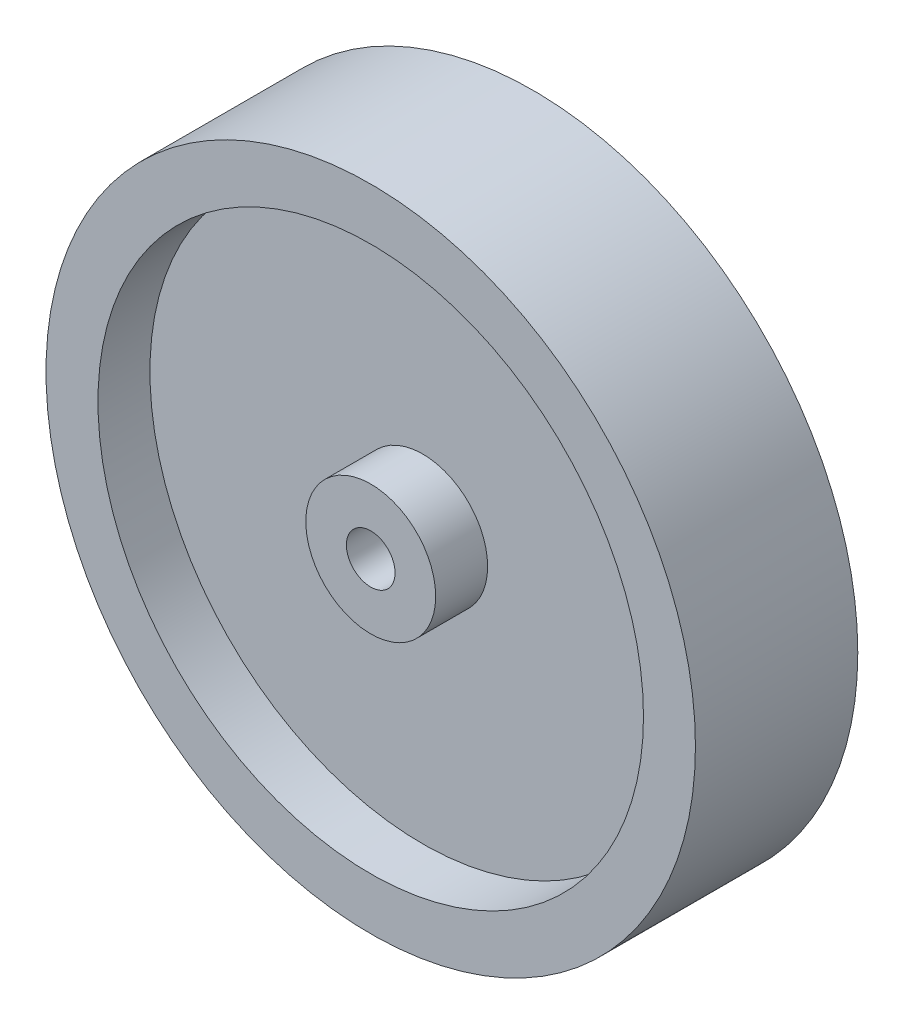
ISO-10303-21;
HEADER;
FILE_DESCRIPTION(('STEP AP214'),'2;1');
FILE_NAME('part.step','',(''),(''),'','','');
FILE_SCHEMA(('AUTOMOTIVE_DESIGN { 1 0 10303 214 1 1 1 1 }'));
ENDSEC;
DATA;
#1=APPLICATION_CONTEXT('core data for automotive mechanical design processes');
#2=APPLICATION_PROTOCOL_DEFINITION('international standard','automotive_design',2000,#1);
#3=PRODUCT_CONTEXT('',#1,'mechanical');
#4=PRODUCT('Part','Part','',(#3));
#5=PRODUCT_RELATED_PRODUCT_CATEGORY('part','',(#4));
#6=PRODUCT_DEFINITION_FORMATION('','',#4);
#7=PRODUCT_DEFINITION_CONTEXT('part definition',#1,'design');
#8=PRODUCT_DEFINITION('design','',#6,#7);
#9=PRODUCT_DEFINITION_SHAPE('','',#8);
#10=(LENGTH_UNIT() NAMED_UNIT(*) SI_UNIT(.MILLI.,.METRE.));
#11=(NAMED_UNIT(*) PLANE_ANGLE_UNIT() SI_UNIT($,.RADIAN.));
#12=(NAMED_UNIT(*) SI_UNIT($,.STERADIAN.) SOLID_ANGLE_UNIT());
#13=UNCERTAINTY_MEASURE_WITH_UNIT(LENGTH_MEASURE(1.E-05),#10,'distance_accuracy_value','');
#14=(GEOMETRIC_REPRESENTATION_CONTEXT(3) GLOBAL_UNCERTAINTY_ASSIGNED_CONTEXT((#13)) GLOBAL_UNIT_ASSIGNED_CONTEXT((#10,
#11,#12)) REPRESENTATION_CONTEXT('',''));
#15=CARTESIAN_POINT('',(0.,0.,0.));
#16=DIRECTION('',(0.,0.,1.));
#17=DIRECTION('',(1.,0.,0.));
#18=AXIS2_PLACEMENT_3D('',#15,#16,#17);
#19=CARTESIAN_POINT('',(0.,0.,-15.875));
#20=DIRECTION('',(0.,0.,1.));
#21=DIRECTION('',(1.,0.,0.));
#22=AXIS2_PLACEMENT_3D('',#19,#20,#21);
#23=PLANE('',#22);
#24=CARTESIAN_POINT('',(0.,0.,-15.875));
#25=DIRECTION('',(0.,0.,1.));
#26=DIRECTION('',(1.,0.,0.));
#27=AXIS2_PLACEMENT_3D('',#24,#25,#26);
#28=CIRCLE('',#27,4.7625);
#29=CARTESIAN_POINT('',(4.7625,0.,-15.875));
#30=VERTEX_POINT('',#29);
#31=EDGE_CURVE('E52',#30,#30,#28,.T.);
#32=ORIENTED_EDGE('',*,*,#31,.T.);
#33=EDGE_LOOP('',(#32));
#34=FACE_BOUND('',#33,.T.);
#35=CARTESIAN_POINT('',(0.,0.,-15.875));
#36=DIRECTION('',(0.,0.,1.));
#37=DIRECTION('',(1.,0.,0.));
#38=AXIS2_PLACEMENT_3D('',#35,#36,#37);
#39=CIRCLE('',#38,12.7);
#40=CARTESIAN_POINT('',(12.7,0.,-15.875));
#41=VERTEX_POINT('',#40);
#42=EDGE_CURVE('E86',#41,#41,#39,.T.);
#43=ORIENTED_EDGE('',*,*,#42,.F.);
#44=EDGE_LOOP('',(#43));
#45=FACE_BOUND('',#44,.T.);
#46=ADVANCED_FACE('F39',(#34,#45),#23,.F.);
#47=CARTESIAN_POINT('',(0.,0.,15.875));
#48=DIRECTION('',(0.,0.,1.));
#49=DIRECTION('',(1.,0.,0.));
#50=AXIS2_PLACEMENT_3D('',#47,#48,#49);
#51=PLANE('',#50);
#52=CARTESIAN_POINT('',(0.,0.,15.875));
#53=DIRECTION('',(0.,0.,1.));
#54=DIRECTION('',(1.,0.,0.));
#55=AXIS2_PLACEMENT_3D('',#52,#53,#54);
#56=CIRCLE('',#55,4.7625);
#57=CARTESIAN_POINT('',(4.7625,0.,15.875));
#58=VERTEX_POINT('',#57);
#59=EDGE_CURVE('E54',#58,#58,#56,.T.);
#60=ORIENTED_EDGE('',*,*,#59,.F.);
#61=EDGE_LOOP('',(#60));
#62=FACE_BOUND('',#61,.T.);
#63=CARTESIAN_POINT('',(0.,0.,15.875));
#64=DIRECTION('',(0.,0.,1.));
#65=DIRECTION('',(1.,0.,0.));
#66=AXIS2_PLACEMENT_3D('',#63,#64,#65);
#67=CIRCLE('',#66,12.7);
#68=CARTESIAN_POINT('',(12.7,0.,15.875));
#69=VERTEX_POINT('',#68);
#70=EDGE_CURVE('E70',#69,#69,#67,.T.);
#71=ORIENTED_EDGE('',*,*,#70,.T.);
#72=EDGE_LOOP('',(#71));
#73=FACE_BOUND('',#72,.T.);
#74=ADVANCED_FACE('F104',(#62,#73),#51,.T.);
#75=CARTESIAN_POINT('',(0.,0.,-15.875));
#76=DIRECTION('',(0.,0.,1.));
#77=DIRECTION('',(1.,0.,0.));
#78=AXIS2_PLACEMENT_3D('',#75,#76,#77);
#79=CYLINDRICAL_SURFACE('',#78,63.5);
#80=CARTESIAN_POINT('',(0.,0.,-15.875));
#81=DIRECTION('',(0.,0.,1.));
#82=DIRECTION('',(1.,0.,0.));
#83=AXIS2_PLACEMENT_3D('',#80,#81,#82);
#84=CIRCLE('',#83,63.5);
#85=CARTESIAN_POINT('',(63.5,0.,-15.875));
#86=VERTEX_POINT('',#85);
#87=EDGE_CURVE('E10',#86,#86,#84,.T.);
#88=ORIENTED_EDGE('',*,*,#87,.T.);
#89=EDGE_LOOP('',(#88));
#90=FACE_BOUND('',#89,.T.);
#91=CARTESIAN_POINT('',(0.,0.,15.875));
#92=DIRECTION('',(0.,0.,1.));
#93=DIRECTION('',(1.,0.,0.));
#94=AXIS2_PLACEMENT_3D('',#91,#92,#93);
#95=CIRCLE('',#94,63.5);
#96=CARTESIAN_POINT('',(63.5,0.,15.875));
#97=VERTEX_POINT('',#96);
#98=EDGE_CURVE('E43',#97,#97,#95,.T.);
#99=ORIENTED_EDGE('',*,*,#98,.F.);
#100=EDGE_LOOP('',(#99));
#101=FACE_BOUND('',#100,.T.);
#102=ADVANCED_FACE('F41',(#90,#101),#79,.T.);
#103=CARTESIAN_POINT('',(0.,0.,-15.875));
#104=DIRECTION('',(0.,0.,1.));
#105=DIRECTION('',(1.,0.,0.));
#106=AXIS2_PLACEMENT_3D('',#103,#104,#105);
#107=CIRCLE('',#106,53.34);
#108=CARTESIAN_POINT('',(53.34,0.,-15.875));
#109=VERTEX_POINT('',#108);
#110=EDGE_CURVE('E78',#109,#109,#107,.T.);
#111=ORIENTED_EDGE('',*,*,#110,.T.);
#112=EDGE_LOOP('',(#111));
#113=FACE_BOUND('',#112,.T.);
#114=ORIENTED_EDGE('',*,*,#87,.F.);
#115=EDGE_LOOP('',(#114));
#116=FACE_BOUND('',#115,.T.);
#117=ADVANCED_FACE('F107',(#113,#116),#23,.F.);
#118=CARTESIAN_POINT('',(0.,0.,15.875));
#119=DIRECTION('',(0.,0.,1.));
#120=DIRECTION('',(1.,0.,0.));
#121=AXIS2_PLACEMENT_3D('',#118,#119,#120);
#122=CIRCLE('',#121,53.34);
#123=CARTESIAN_POINT('',(53.34,0.,15.875));
#124=VERTEX_POINT('',#123);
#125=EDGE_CURVE('E62',#124,#124,#122,.T.);
#126=ORIENTED_EDGE('',*,*,#125,.F.);
#127=EDGE_LOOP('',(#126));
#128=FACE_BOUND('',#127,.T.);
#129=ORIENTED_EDGE('',*,*,#98,.T.);
#130=EDGE_LOOP('',(#129));
#131=FACE_BOUND('',#130,.T.);
#132=ADVANCED_FACE('F112',(#128,#131),#51,.T.);
#133=CARTESIAN_POINT('',(0.,0.,-15.875));
#134=DIRECTION('',(0.,0.,1.));
#135=DIRECTION('',(1.,0.,0.));
#136=AXIS2_PLACEMENT_3D('',#133,#134,#135);
#137=CYLINDRICAL_SURFACE('',#136,4.7625);
#138=ORIENTED_EDGE('',*,*,#31,.F.);
#139=EDGE_LOOP('',(#138));
#140=FACE_BOUND('',#139,.T.);
#141=ORIENTED_EDGE('',*,*,#59,.T.);
#142=EDGE_LOOP('',(#141));
#143=FACE_BOUND('',#142,.T.);
#144=ADVANCED_FACE('F120',(#140,#143),#137,.F.);
#145=CARTESIAN_POINT('',(0.,0.,5.715));
#146=DIRECTION('',(0.,0.,1.));
#147=DIRECTION('',(1.,0.,0.));
#148=AXIS2_PLACEMENT_3D('',#145,#146,#147);
#149=CYLINDRICAL_SURFACE('',#148,53.34);
#150=CARTESIAN_POINT('',(0.,0.,5.715));
#151=DIRECTION('',(0.,0.,1.));
#152=DIRECTION('',(1.,0.,0.));
#153=AXIS2_PLACEMENT_3D('',#150,#151,#152);
#154=CIRCLE('',#153,53.34);
#155=CARTESIAN_POINT('',(53.34,0.,5.715));
#156=VERTEX_POINT('',#155);
#157=EDGE_CURVE('E58',#156,#156,#154,.T.);
#158=ORIENTED_EDGE('',*,*,#157,.F.);
#159=EDGE_LOOP('',(#158));
#160=FACE_BOUND('',#159,.T.);
#161=ORIENTED_EDGE('',*,*,#125,.T.);
#162=EDGE_LOOP('',(#161));
#163=FACE_BOUND('',#162,.T.);
#164=ADVANCED_FACE('F141',(#160,#163),#149,.F.);
#165=CARTESIAN_POINT('',(0.,0.,5.715));
#166=DIRECTION('',(0.,0.,1.));
#167=DIRECTION('',(1.,0.,0.));
#168=AXIS2_PLACEMENT_3D('',#165,#166,#167);
#169=PLANE('',#168);
#170=CARTESIAN_POINT('',(0.,0.,5.715));
#171=DIRECTION('',(0.,0.,1.));
#172=DIRECTION('',(1.,0.,0.));
#173=AXIS2_PLACEMENT_3D('',#170,#171,#172);
#174=CIRCLE('',#173,12.7);
#175=CARTESIAN_POINT('',(12.7,0.,5.715));
#176=VERTEX_POINT('',#175);
#177=EDGE_CURVE('E66',#176,#176,#174,.T.);
#178=ORIENTED_EDGE('',*,*,#177,.F.);
#179=EDGE_LOOP('',(#178));
#180=FACE_BOUND('',#179,.T.);
#181=ORIENTED_EDGE('',*,*,#157,.T.);
#182=EDGE_LOOP('',(#181));
#183=FACE_BOUND('',#182,.T.);
#184=ADVANCED_FACE('F137',(#180,#183),#169,.T.);
#185=CARTESIAN_POINT('',(0.,0.,5.715));
#186=DIRECTION('',(0.,0.,1.));
#187=DIRECTION('',(1.,0.,0.));
#188=AXIS2_PLACEMENT_3D('',#185,#186,#187);
#189=CYLINDRICAL_SURFACE('',#188,12.7);
#190=ORIENTED_EDGE('',*,*,#177,.T.);
#191=EDGE_LOOP('',(#190));
#192=FACE_BOUND('',#191,.T.);
#193=ORIENTED_EDGE('',*,*,#70,.F.);
#194=EDGE_LOOP('',(#193));
#195=FACE_BOUND('',#194,.T.);
#196=ADVANCED_FACE('F131',(#192,#195),#189,.T.);
#197=CARTESIAN_POINT('',(0.,0.,-5.715));
#198=DIRECTION('',(0.,0.,-1.));
#199=DIRECTION('',(1.,0.,0.));
#200=AXIS2_PLACEMENT_3D('',#197,#198,#199);
#201=PLANE('',#200);
#202=CARTESIAN_POINT('',(0.,0.,-5.715));
#203=DIRECTION('',(0.,0.,1.));
#204=DIRECTION('',(1.,0.,0.));
#205=AXIS2_PLACEMENT_3D('',#202,#203,#204);
#206=CIRCLE('',#205,53.34);
#207=CARTESIAN_POINT('',(53.34,0.,-5.715));
#208=VERTEX_POINT('',#207);
#209=EDGE_CURVE('E74',#208,#208,#206,.T.);
#210=ORIENTED_EDGE('',*,*,#209,.F.);
#211=EDGE_LOOP('',(#210));
#212=FACE_BOUND('',#211,.T.);
#213=CARTESIAN_POINT('',(0.,0.,-5.715));
#214=DIRECTION('',(0.,0.,1.));
#215=DIRECTION('',(1.,0.,0.));
#216=AXIS2_PLACEMENT_3D('',#213,#214,#215);
#217=CIRCLE('',#216,12.7);
#218=CARTESIAN_POINT('',(12.7,0.,-5.715));
#219=VERTEX_POINT('',#218);
#220=EDGE_CURVE('E82',#219,#219,#217,.T.);
#221=ORIENTED_EDGE('',*,*,#220,.T.);
#222=EDGE_LOOP('',(#221));
#223=FACE_BOUND('',#222,.T.);
#224=ADVANCED_FACE('F94',(#212,#223),#201,.T.);
#225=CARTESIAN_POINT('',(0.,0.,-5.715));
#226=DIRECTION('',(0.,0.,-1.));
#227=DIRECTION('',(-1.,0.,0.));
#228=AXIS2_PLACEMENT_3D('',#225,#226,#227);
#229=CYLINDRICAL_SURFACE('',#228,53.34);
#230=ORIENTED_EDGE('',*,*,#209,.T.);
#231=EDGE_LOOP('',(#230));
#232=FACE_BOUND('',#231,.T.);
#233=ORIENTED_EDGE('',*,*,#110,.F.);
#234=EDGE_LOOP('',(#233));
#235=FACE_BOUND('',#234,.T.);
#236=ADVANCED_FACE('F99',(#232,#235),#229,.F.);
#237=CARTESIAN_POINT('',(0.,0.,-5.715));
#238=DIRECTION('',(0.,0.,-1.));
#239=DIRECTION('',(-1.,0.,0.));
#240=AXIS2_PLACEMENT_3D('',#237,#238,#239);
#241=CYLINDRICAL_SURFACE('',#240,12.7);
#242=ORIENTED_EDGE('',*,*,#220,.F.);
#243=EDGE_LOOP('',(#242));
#244=FACE_BOUND('',#243,.T.);
#245=ORIENTED_EDGE('',*,*,#42,.T.);
#246=EDGE_LOOP('',(#245));
#247=FACE_BOUND('',#246,.T.);
#248=ADVANCED_FACE('F96',(#244,#247),#241,.T.);
#249=CLOSED_SHELL('',(#46,#74,#102,#117,#132,#144,#164,#184,#196,#224,#236,#248));
#250=MANIFOLD_SOLID_BREP('B2',#249);
#251=ADVANCED_BREP_SHAPE_REPRESENTATION('',(#18,#250),#14);
#252=SHAPE_DEFINITION_REPRESENTATION(#9,#251);
ENDSEC;
END-ISO-10303-21;
